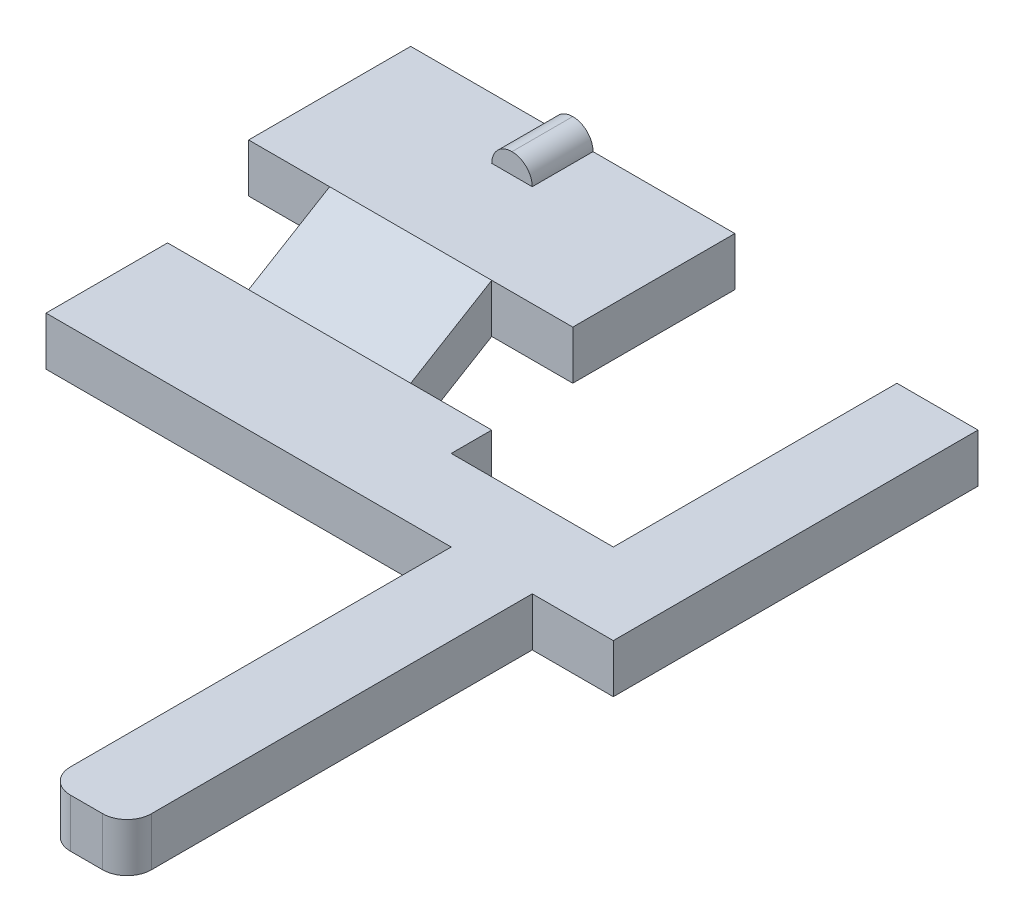
ISO-10303-21;
HEADER;
FILE_DESCRIPTION(('STEP AP214'),'2;1');
FILE_NAME('part.step','',(''),(''),'','','');
FILE_SCHEMA(('AUTOMOTIVE_DESIGN { 1 0 10303 214 1 1 1 1 }'));
ENDSEC;
DATA;
#1=APPLICATION_CONTEXT('core data for automotive mechanical design processes');
#2=APPLICATION_PROTOCOL_DEFINITION('international standard','automotive_design',2000,#1);
#3=PRODUCT_CONTEXT('',#1,'mechanical');
#4=PRODUCT('Part','Part','',(#3));
#5=PRODUCT_RELATED_PRODUCT_CATEGORY('part','',(#4));
#6=PRODUCT_DEFINITION_FORMATION('','',#4);
#7=PRODUCT_DEFINITION_CONTEXT('part definition',#1,'design');
#8=PRODUCT_DEFINITION('design','',#6,#7);
#9=PRODUCT_DEFINITION_SHAPE('','',#8);
#10=(LENGTH_UNIT() NAMED_UNIT(*) SI_UNIT(.MILLI.,.METRE.));
#11=(NAMED_UNIT(*) PLANE_ANGLE_UNIT() SI_UNIT($,.RADIAN.));
#12=(NAMED_UNIT(*) SI_UNIT($,.STERADIAN.) SOLID_ANGLE_UNIT());
#13=UNCERTAINTY_MEASURE_WITH_UNIT(LENGTH_MEASURE(1.E-05),#10,'distance_accuracy_value','');
#14=(GEOMETRIC_REPRESENTATION_CONTEXT(3) GLOBAL_UNCERTAINTY_ASSIGNED_CONTEXT((#13)) GLOBAL_UNIT_ASSIGNED_CONTEXT((#10,
#11,#12)) REPRESENTATION_CONTEXT('',''));
#15=CARTESIAN_POINT('',(0.,0.,0.));
#16=DIRECTION('',(0.,0.,1.));
#17=DIRECTION('',(1.,0.,0.));
#18=AXIS2_PLACEMENT_3D('',#15,#16,#17);
#19=CARTESIAN_POINT('',(-2.,0.6,-6.5));
#20=DIRECTION('',(0.,0.,1.));
#21=DIRECTION('',(1.,0.,0.));
#22=AXIS2_PLACEMENT_3D('',#19,#20,#21);
#23=PLANE('',#22);
#24=DIRECTION('',(-1.,0.,0.));
#25=VECTOR('',#24,1.);
#26=CARTESIAN_POINT('',(-2.,0.,-6.5));
#27=LINE('',#26,#25);
#28=CARTESIAN_POINT('',(-2.,0.,-6.5));
#29=VERTEX_POINT('',#28);
#30=CARTESIAN_POINT('',(-3.,0.,-6.5));
#31=VERTEX_POINT('',#30);
#32=EDGE_CURVE('E325',#29,#31,#27,.T.);
#33=ORIENTED_EDGE('',*,*,#32,.T.);
#34=DIRECTION('',(0.,-1.,0.));
#35=VECTOR('',#34,1.);
#36=CARTESIAN_POINT('',(-3.,0.6,-6.5));
#37=LINE('',#36,#35);
#38=CARTESIAN_POINT('',(-3.,0.6,-6.5));
#39=VERTEX_POINT('',#38);
#40=EDGE_CURVE('E462',#39,#31,#37,.T.);
#41=ORIENTED_EDGE('',*,*,#40,.F.);
#42=DIRECTION('',(-1.,0.,0.));
#43=VECTOR('',#42,1.);
#44=CARTESIAN_POINT('',(-2.,0.6,-6.5));
#45=LINE('',#44,#43);
#46=CARTESIAN_POINT('',(-2.,0.6,-6.5));
#47=VERTEX_POINT('',#46);
#48=EDGE_CURVE('E319',#47,#39,#45,.T.);
#49=ORIENTED_EDGE('',*,*,#48,.F.);
#50=DIRECTION('',(0.,-1.,0.));
#51=VECTOR('',#50,1.);
#52=CARTESIAN_POINT('',(-2.,0.6,-6.5));
#53=LINE('',#52,#51);
#54=EDGE_CURVE('E349',#47,#29,#53,.T.);
#55=ORIENTED_EDGE('',*,*,#54,.T.);
#56=EDGE_LOOP('',(#33,#41,#49,#55));
#57=FACE_BOUND('',#56,.T.);
#58=ADVANCED_FACE('F42',(#57),#23,.F.);
#59=CARTESIAN_POINT('',(-0.999999999999999,0.6,0.));
#60=DIRECTION('',(0.,0.,-1.));
#61=DIRECTION('',(-1.,0.,0.));
#62=AXIS2_PLACEMENT_3D('',#59,#60,#61);
#63=PLANE('',#62);
#64=DIRECTION('',(1.,0.,0.));
#65=VECTOR('',#64,1.);
#66=CARTESIAN_POINT('',(-0.999999999999999,0.6,0.));
#67=LINE('',#66,#65);
#68=CARTESIAN_POINT('',(-0.699999999999999,0.6,0.));
#69=VERTEX_POINT('',#68);
#70=CARTESIAN_POINT('',(-0.3,0.6,0.));
#71=VERTEX_POINT('',#70);
#72=EDGE_CURVE('E292',#69,#71,#67,.T.);
#73=ORIENTED_EDGE('',*,*,#72,.F.);
#74=DIRECTION('',(0.,-1.,0.));
#75=VECTOR('',#74,1.);
#76=CARTESIAN_POINT('',(-0.699999999999999,0.6,0.));
#77=LINE('',#76,#75);
#78=CARTESIAN_POINT('',(-0.699999999999999,0.,0.));
#79=VERTEX_POINT('',#78);
#80=EDGE_CURVE('E373',#69,#79,#77,.T.);
#81=ORIENTED_EDGE('',*,*,#80,.T.);
#82=DIRECTION('',(1.,0.,0.));
#83=VECTOR('',#82,1.);
#84=CARTESIAN_POINT('',(-0.999999999999999,0.,0.));
#85=LINE('',#84,#83);
#86=CARTESIAN_POINT('',(-0.3,0.,0.));
#87=VERTEX_POINT('',#86);
#88=EDGE_CURVE('E449',#79,#87,#85,.T.);
#89=ORIENTED_EDGE('',*,*,#88,.T.);
#90=DIRECTION('',(0.,-1.,0.));
#91=VECTOR('',#90,1.);
#92=CARTESIAN_POINT('',(-0.3,0.6,0.));
#93=LINE('',#92,#91);
#94=EDGE_CURVE('E368',#87,#71,#93,.F.);
#95=ORIENTED_EDGE('',*,*,#94,.T.);
#96=EDGE_LOOP('',(#73,#81,#89,#95));
#97=FACE_BOUND('',#96,.T.);
#98=ADVANCED_FACE('F409',(#97),#63,.F.);
#99=CARTESIAN_POINT('',(0.,0.6,0.));
#100=DIRECTION('',(-1.,0.,0.));
#101=DIRECTION('',(0.,0.,1.));
#102=AXIS2_PLACEMENT_3D('',#99,#100,#101);
#103=PLANE('',#102);
#104=DIRECTION('',(0.,0.,-1.));
#105=VECTOR('',#104,1.);
#106=CARTESIAN_POINT('',(0.,0.6,0.));
#107=LINE('',#106,#105);
#108=CARTESIAN_POINT('',(0.,0.6,-0.3));
#109=VERTEX_POINT('',#108);
#110=CARTESIAN_POINT('',(0.,0.6,-5.));
#111=VERTEX_POINT('',#110);
#112=EDGE_CURVE('E295',#109,#111,#107,.T.);
#113=ORIENTED_EDGE('',*,*,#112,.F.);
#114=DIRECTION('',(0.,-1.,0.));
#115=VECTOR('',#114,1.);
#116=CARTESIAN_POINT('',(0.,0.6,-0.3));
#117=LINE('',#116,#115);
#118=CARTESIAN_POINT('',(0.,0.,-0.3));
#119=VERTEX_POINT('',#118);
#120=EDGE_CURVE('E391',#109,#119,#117,.T.);
#121=ORIENTED_EDGE('',*,*,#120,.T.);
#122=DIRECTION('',(0.,0.,-1.));
#123=VECTOR('',#122,1.);
#124=CARTESIAN_POINT('',(0.,0.,0.));
#125=LINE('',#124,#123);
#126=CARTESIAN_POINT('',(0.,0.,-5.));
#127=VERTEX_POINT('',#126);
#128=EDGE_CURVE('E451',#119,#127,#125,.T.);
#129=ORIENTED_EDGE('',*,*,#128,.T.);
#130=DIRECTION('',(0.,-1.,0.));
#131=VECTOR('',#130,1.);
#132=CARTESIAN_POINT('',(0.,0.6,-5.));
#133=LINE('',#132,#131);
#134=EDGE_CURVE('E366',#111,#127,#133,.T.);
#135=ORIENTED_EDGE('',*,*,#134,.F.);
#136=EDGE_LOOP('',(#113,#121,#129,#135));
#137=FACE_BOUND('',#136,.T.);
#138=ADVANCED_FACE('F416',(#137),#103,.F.);
#139=CARTESIAN_POINT('',(0.,0.6,-5.));
#140=DIRECTION('',(0.,0.,-1.));
#141=DIRECTION('',(-1.,0.,0.));
#142=AXIS2_PLACEMENT_3D('',#139,#140,#141);
#143=PLANE('',#142);
#144=DIRECTION('',(1.,0.,0.));
#145=VECTOR('',#144,1.);
#146=CARTESIAN_POINT('',(0.,0.,-5.));
#147=LINE('',#146,#145);
#148=CARTESIAN_POINT('',(1.,0.,-5.));
#149=VERTEX_POINT('',#148);
#150=EDGE_CURVE('E570',#127,#149,#147,.T.);
#151=ORIENTED_EDGE('',*,*,#150,.T.);
#152=DIRECTION('',(0.,-1.,0.));
#153=VECTOR('',#152,1.);
#154=CARTESIAN_POINT('',(1.,0.6,-5.));
#155=LINE('',#154,#153);
#156=CARTESIAN_POINT('',(1.,0.6,-5.));
#157=VERTEX_POINT('',#156);
#158=EDGE_CURVE('E364',#157,#149,#155,.T.);
#159=ORIENTED_EDGE('',*,*,#158,.F.);
#160=DIRECTION('',(1.,0.,0.));
#161=VECTOR('',#160,1.);
#162=CARTESIAN_POINT('',(0.,0.6,-5.));
#163=LINE('',#162,#161);
#164=EDGE_CURVE('E298',#111,#157,#163,.T.);
#165=ORIENTED_EDGE('',*,*,#164,.F.);
#166=ORIENTED_EDGE('',*,*,#134,.T.);
#167=EDGE_LOOP('',(#151,#159,#165,#166));
#168=FACE_BOUND('',#167,.T.);
#169=ADVANCED_FACE('F668',(#168),#143,.F.);
#170=CARTESIAN_POINT('',(1.,0.6,-5.));
#171=DIRECTION('',(-1.,0.,0.));
#172=DIRECTION('',(0.,0.,1.));
#173=AXIS2_PLACEMENT_3D('',#170,#171,#172);
#174=PLANE('',#173);
#175=DIRECTION('',(0.,0.,-1.));
#176=VECTOR('',#175,1.);
#177=CARTESIAN_POINT('',(1.,0.,-5.));
#178=LINE('',#177,#176);
#179=CARTESIAN_POINT('',(1.,0.,-9.5));
#180=VERTEX_POINT('',#179);
#181=EDGE_CURVE('E572',#149,#180,#178,.T.);
#182=ORIENTED_EDGE('',*,*,#181,.T.);
#183=DIRECTION('',(0.,-1.,0.));
#184=VECTOR('',#183,1.);
#185=CARTESIAN_POINT('',(1.,0.6,-9.5));
#186=LINE('',#185,#184);
#187=CARTESIAN_POINT('',(1.,0.6,-9.5));
#188=VERTEX_POINT('',#187);
#189=EDGE_CURVE('E361',#188,#180,#186,.T.);
#190=ORIENTED_EDGE('',*,*,#189,.F.);
#191=DIRECTION('',(0.,0.,-1.));
#192=VECTOR('',#191,1.);
#193=CARTESIAN_POINT('',(1.,0.6,-5.));
#194=LINE('',#193,#192);
#195=EDGE_CURVE('E300',#157,#188,#194,.T.);
#196=ORIENTED_EDGE('',*,*,#195,.F.);
#197=ORIENTED_EDGE('',*,*,#158,.T.);
#198=EDGE_LOOP('',(#182,#190,#196,#197));
#199=FACE_BOUND('',#198,.T.);
#200=ADVANCED_FACE('F741',(#199),#174,.F.);
#201=CARTESIAN_POINT('',(1.,0.6,-9.5));
#202=DIRECTION('',(0.,0.,1.));
#203=DIRECTION('',(1.,0.,0.));
#204=AXIS2_PLACEMENT_3D('',#201,#202,#203);
#205=PLANE('',#204);
#206=DIRECTION('',(-1.,0.,0.));
#207=VECTOR('',#206,1.);
#208=CARTESIAN_POINT('',(1.,0.,-9.5));
#209=LINE('',#208,#207);
#210=CARTESIAN_POINT('',(0.,0.,-9.5));
#211=VERTEX_POINT('',#210);
#212=EDGE_CURVE('E577',#180,#211,#209,.T.);
#213=ORIENTED_EDGE('',*,*,#212,.T.);
#214=DIRECTION('',(0.,-1.,0.));
#215=VECTOR('',#214,1.);
#216=CARTESIAN_POINT('',(0.,0.6,-9.5));
#217=LINE('',#216,#215);
#218=CARTESIAN_POINT('',(0.,0.6,-9.5));
#219=VERTEX_POINT('',#218);
#220=EDGE_CURVE('E358',#219,#211,#217,.T.);
#221=ORIENTED_EDGE('',*,*,#220,.F.);
#222=DIRECTION('',(-1.,0.,0.));
#223=VECTOR('',#222,1.);
#224=CARTESIAN_POINT('',(1.,0.6,-9.5));
#225=LINE('',#224,#223);
#226=EDGE_CURVE('E302',#188,#219,#225,.T.);
#227=ORIENTED_EDGE('',*,*,#226,.F.);
#228=ORIENTED_EDGE('',*,*,#189,.T.);
#229=EDGE_LOOP('',(#213,#221,#227,#228));
#230=FACE_BOUND('',#229,.T.);
#231=ADVANCED_FACE('F744',(#230),#205,.F.);
#232=CARTESIAN_POINT('',(0.,0.6,-9.5));
#233=DIRECTION('',(1.,0.,0.));
#234=DIRECTION('',(0.,0.,-1.));
#235=AXIS2_PLACEMENT_3D('',#232,#233,#234);
#236=PLANE('',#235);
#237=DIRECTION('',(0.,0.,1.));
#238=VECTOR('',#237,1.);
#239=CARTESIAN_POINT('',(0.,0.,-9.5));
#240=LINE('',#239,#238);
#241=CARTESIAN_POINT('',(0.,0.,-6.));
#242=VERTEX_POINT('',#241);
#243=EDGE_CURVE('E579',#211,#242,#240,.T.);
#244=ORIENTED_EDGE('',*,*,#243,.T.);
#245=DIRECTION('',(0.,-1.,0.));
#246=VECTOR('',#245,1.);
#247=CARTESIAN_POINT('',(0.,0.6,-6.));
#248=LINE('',#247,#246);
#249=CARTESIAN_POINT('',(0.,0.6,-6.));
#250=VERTEX_POINT('',#249);
#251=EDGE_CURVE('E355',#250,#242,#248,.T.);
#252=ORIENTED_EDGE('',*,*,#251,.F.);
#253=DIRECTION('',(0.,0.,1.));
#254=VECTOR('',#253,1.);
#255=CARTESIAN_POINT('',(0.,0.6,-9.5));
#256=LINE('',#255,#254);
#257=EDGE_CURVE('E304',#219,#250,#256,.T.);
#258=ORIENTED_EDGE('',*,*,#257,.F.);
#259=ORIENTED_EDGE('',*,*,#220,.T.);
#260=EDGE_LOOP('',(#244,#252,#258,#259));
#261=FACE_BOUND('',#260,.T.);
#262=ADVANCED_FACE('F748',(#261),#236,.F.);
#263=CARTESIAN_POINT('',(0.,0.6,-6.));
#264=DIRECTION('',(0.,0.,1.));
#265=DIRECTION('',(1.,0.,0.));
#266=AXIS2_PLACEMENT_3D('',#263,#264,#265);
#267=PLANE('',#266);
#268=DIRECTION('',(-1.,0.,0.));
#269=VECTOR('',#268,1.);
#270=CARTESIAN_POINT('',(0.,0.,-6.));
#271=LINE('',#270,#269);
#272=CARTESIAN_POINT('',(-2.,0.,-6.));
#273=VERTEX_POINT('',#272);
#274=EDGE_CURVE('E580',#242,#273,#271,.T.);
#275=ORIENTED_EDGE('',*,*,#274,.T.);
#276=DIRECTION('',(0.,-1.,0.));
#277=VECTOR('',#276,1.);
#278=CARTESIAN_POINT('',(-2.,0.6,-6.));
#279=LINE('',#278,#277);
#280=CARTESIAN_POINT('',(-2.,0.6,-6.));
#281=VERTEX_POINT('',#280);
#282=EDGE_CURVE('E352',#281,#273,#279,.T.);
#283=ORIENTED_EDGE('',*,*,#282,.F.);
#284=DIRECTION('',(-1.,0.,0.));
#285=VECTOR('',#284,1.);
#286=CARTESIAN_POINT('',(0.,0.6,-6.));
#287=LINE('',#286,#285);
#288=EDGE_CURVE('E306',#250,#281,#287,.T.);
#289=ORIENTED_EDGE('',*,*,#288,.F.);
#290=ORIENTED_EDGE('',*,*,#251,.T.);
#291=EDGE_LOOP('',(#275,#283,#289,#290));
#292=FACE_BOUND('',#291,.T.);
#293=ADVANCED_FACE('F431',(#292),#267,.F.);
#294=CARTESIAN_POINT('',(-2.,0.6,-6.));
#295=DIRECTION('',(-1.,0.,0.));
#296=DIRECTION('',(0.,0.,1.));
#297=AXIS2_PLACEMENT_3D('',#294,#295,#296);
#298=PLANE('',#297);
#299=DIRECTION('',(0.,0.,-1.));
#300=VECTOR('',#299,1.);
#301=CARTESIAN_POINT('',(-2.,0.,-6.));
#302=LINE('',#301,#300);
#303=EDGE_CURVE('E326',#273,#29,#302,.T.);
#304=ORIENTED_EDGE('',*,*,#303,.T.);
#305=ORIENTED_EDGE('',*,*,#54,.F.);
#306=DIRECTION('',(0.,0.,-1.));
#307=VECTOR('',#306,1.);
#308=CARTESIAN_POINT('',(-2.,0.6,-6.));
#309=LINE('',#308,#307);
#310=EDGE_CURVE('E308',#281,#47,#309,.T.);
#311=ORIENTED_EDGE('',*,*,#310,.F.);
#312=ORIENTED_EDGE('',*,*,#282,.T.);
#313=EDGE_LOOP('',(#304,#305,#311,#312));
#314=FACE_BOUND('',#313,.T.);
#315=ADVANCED_FACE('F423',(#314),#298,.F.);
#316=CARTESIAN_POINT('',(-5.,0.6,-6.5));
#317=VERTEX_POINT('',#316);
#318=CARTESIAN_POINT('',(-6.,0.6,-6.5));
#319=VERTEX_POINT('',#318);
#320=EDGE_CURVE('E310',#317,#319,#45,.T.);
#321=ORIENTED_EDGE('',*,*,#320,.F.);
#322=DIRECTION('',(0.,1.,0.));
#323=VECTOR('',#322,1.);
#324=CARTESIAN_POINT('',(-5.,0.6,-6.5));
#325=LINE('',#324,#323);
#326=CARTESIAN_POINT('',(-5.,0.,-6.5));
#327=VERTEX_POINT('',#326);
#328=EDGE_CURVE('E437',#327,#317,#325,.T.);
#329=ORIENTED_EDGE('',*,*,#328,.F.);
#330=CARTESIAN_POINT('',(-6.,0.,-6.5));
#331=VERTEX_POINT('',#330);
#332=EDGE_CURVE('E322',#327,#331,#27,.T.);
#333=ORIENTED_EDGE('',*,*,#332,.T.);
#334=DIRECTION('',(0.,-1.,0.));
#335=VECTOR('',#334,1.);
#336=CARTESIAN_POINT('',(-6.,0.6,-6.5));
#337=LINE('',#336,#335);
#338=EDGE_CURVE('E346',#319,#331,#337,.T.);
#339=ORIENTED_EDGE('',*,*,#338,.F.);
#340=EDGE_LOOP('',(#321,#329,#333,#339));
#341=FACE_BOUND('',#340,.T.);
#342=ADVANCED_FACE('F412',(#341),#23,.F.);
#343=CARTESIAN_POINT('',(-6.,0.6,-6.5));
#344=DIRECTION('',(1.,0.,0.));
#345=DIRECTION('',(0.,0.,-1.));
#346=AXIS2_PLACEMENT_3D('',#343,#344,#345);
#347=PLANE('',#346);
#348=DIRECTION('',(0.,0.,1.));
#349=VECTOR('',#348,1.);
#350=CARTESIAN_POINT('',(-6.,0.,-6.5));
#351=LINE('',#350,#349);
#352=CARTESIAN_POINT('',(-6.,0.,-5.));
#353=VERTEX_POINT('',#352);
#354=EDGE_CURVE('E332',#331,#353,#351,.T.);
#355=ORIENTED_EDGE('',*,*,#354,.T.);
#356=DIRECTION('',(0.,-1.,0.));
#357=VECTOR('',#356,1.);
#358=CARTESIAN_POINT('',(-6.,0.6,-5.));
#359=LINE('',#358,#357);
#360=CARTESIAN_POINT('',(-6.,0.6,-5.));
#361=VERTEX_POINT('',#360);
#362=EDGE_CURVE('E342',#361,#353,#359,.T.);
#363=ORIENTED_EDGE('',*,*,#362,.F.);
#364=DIRECTION('',(0.,0.,1.));
#365=VECTOR('',#364,1.);
#366=CARTESIAN_POINT('',(-6.,0.6,-6.5));
#367=LINE('',#366,#365);
#368=EDGE_CURVE('E313',#319,#361,#367,.T.);
#369=ORIENTED_EDGE('',*,*,#368,.F.);
#370=ORIENTED_EDGE('',*,*,#338,.T.);
#371=EDGE_LOOP('',(#355,#363,#369,#370));
#372=FACE_BOUND('',#371,.T.);
#373=ADVANCED_FACE('F422',(#372),#347,.F.);
#374=CARTESIAN_POINT('',(-6.,0.6,-5.));
#375=DIRECTION('',(0.,0.,-1.));
#376=DIRECTION('',(-1.,0.,0.));
#377=AXIS2_PLACEMENT_3D('',#374,#375,#376);
#378=PLANE('',#377);
#379=DIRECTION('',(1.,0.,0.));
#380=VECTOR('',#379,1.);
#381=CARTESIAN_POINT('',(-6.,0.,-5.));
#382=LINE('',#381,#380);
#383=CARTESIAN_POINT('',(-1.,0.,-5.));
#384=VERTEX_POINT('',#383);
#385=EDGE_CURVE('E335',#353,#384,#382,.T.);
#386=ORIENTED_EDGE('',*,*,#385,.T.);
#387=DIRECTION('',(0.,-1.,0.));
#388=VECTOR('',#387,1.);
#389=CARTESIAN_POINT('',(-1.,0.6,-5.));
#390=LINE('',#389,#388);
#391=CARTESIAN_POINT('',(-1.,0.6,-5.));
#392=VERTEX_POINT('',#391);
#393=EDGE_CURVE('E339',#392,#384,#390,.T.);
#394=ORIENTED_EDGE('',*,*,#393,.F.);
#395=DIRECTION('',(1.,0.,0.));
#396=VECTOR('',#395,1.);
#397=CARTESIAN_POINT('',(-6.,0.6,-5.));
#398=LINE('',#397,#396);
#399=EDGE_CURVE('E839',#361,#392,#398,.T.);
#400=ORIENTED_EDGE('',*,*,#399,.F.);
#401=ORIENTED_EDGE('',*,*,#362,.T.);
#402=EDGE_LOOP('',(#386,#394,#400,#401));
#403=FACE_BOUND('',#402,.T.);
#404=ADVANCED_FACE('F429',(#403),#378,.F.);
#405=CARTESIAN_POINT('',(-1.,0.6,-5.));
#406=DIRECTION('',(1.,0.,0.));
#407=DIRECTION('',(0.,0.,-1.));
#408=AXIS2_PLACEMENT_3D('',#405,#406,#407);
#409=PLANE('',#408);
#410=DIRECTION('',(0.,0.,1.));
#411=VECTOR('',#410,1.);
#412=CARTESIAN_POINT('',(-1.,0.,-5.));
#413=LINE('',#412,#411);
#414=CARTESIAN_POINT('',(-0.999999999999999,0.,-0.3));
#415=VERTEX_POINT('',#414);
#416=EDGE_CURVE('E296',#384,#415,#413,.T.);
#417=ORIENTED_EDGE('',*,*,#416,.T.);
#418=DIRECTION('',(0.,-1.,0.));
#419=VECTOR('',#418,1.);
#420=CARTESIAN_POINT('',(-0.999999999999999,0.6,-0.3));
#421=LINE('',#420,#419);
#422=CARTESIAN_POINT('',(-0.999999999999999,0.6,-0.3));
#423=VERTEX_POINT('',#422);
#424=EDGE_CURVE('E385',#415,#423,#421,.F.);
#425=ORIENTED_EDGE('',*,*,#424,.T.);
#426=DIRECTION('',(0.,0.,1.));
#427=VECTOR('',#426,1.);
#428=CARTESIAN_POINT('',(-1.,0.6,-5.));
#429=LINE('',#428,#427);
#430=EDGE_CURVE('E343',#392,#423,#429,.T.);
#431=ORIENTED_EDGE('',*,*,#430,.F.);
#432=ORIENTED_EDGE('',*,*,#393,.T.);
#433=EDGE_LOOP('',(#417,#425,#431,#432));
#434=FACE_BOUND('',#433,.T.);
#435=ADVANCED_FACE('F538',(#434),#409,.F.);
#436=CARTESIAN_POINT('',(0.,0.6,0.));
#437=DIRECTION('',(0.,1.,0.));
#438=DIRECTION('',(0.,0.,1.));
#439=AXIS2_PLACEMENT_3D('',#436,#437,#438);
#440=PLANE('',#439);
#441=ORIENTED_EDGE('',*,*,#430,.T.);
#442=CARTESIAN_POINT('',(-0.699999999999999,0.6,-0.3));
#443=DIRECTION('',(0.,1.,0.));
#444=DIRECTION('',(0.,0.,1.));
#445=AXIS2_PLACEMENT_3D('',#442,#443,#444);
#446=CIRCLE('',#445,0.3);
#447=EDGE_CURVE('E389',#423,#69,#446,.T.);
#448=ORIENTED_EDGE('',*,*,#447,.T.);
#449=ORIENTED_EDGE('',*,*,#72,.T.);
#450=CARTESIAN_POINT('',(-0.3,0.6,-0.3));
#451=DIRECTION('',(0.,1.,0.));
#452=DIRECTION('',(0.,0.,1.));
#453=AXIS2_PLACEMENT_3D('',#450,#451,#452);
#454=CIRCLE('',#453,0.3);
#455=EDGE_CURVE('E387',#71,#109,#454,.T.);
#456=ORIENTED_EDGE('',*,*,#455,.T.);
#457=ORIENTED_EDGE('',*,*,#112,.T.);
#458=ORIENTED_EDGE('',*,*,#164,.T.);
#459=ORIENTED_EDGE('',*,*,#195,.T.);
#460=ORIENTED_EDGE('',*,*,#226,.T.);
#461=ORIENTED_EDGE('',*,*,#257,.T.);
#462=ORIENTED_EDGE('',*,*,#288,.T.);
#463=ORIENTED_EDGE('',*,*,#310,.T.);
#464=ORIENTED_EDGE('',*,*,#48,.T.);
#465=DIRECTION('',(1.,0.,0.));
#466=VECTOR('',#465,1.);
#467=CARTESIAN_POINT('',(-3.,0.6,-6.5));
#468=LINE('',#467,#466);
#469=EDGE_CURVE('E442',#317,#39,#468,.T.);
#470=ORIENTED_EDGE('',*,*,#469,.F.);
#471=ORIENTED_EDGE('',*,*,#320,.T.);
#472=ORIENTED_EDGE('',*,*,#368,.T.);
#473=ORIENTED_EDGE('',*,*,#399,.T.);
#474=EDGE_LOOP('',(#441,#448,#449,#456,#457,#458,#459,#460,#461,#462,#463,#464,#470,#471,#472,#473));
#475=FACE_BOUND('',#474,.T.);
#476=ADVANCED_FACE('F444',(#475),#440,.T.);
#477=CARTESIAN_POINT('',(0.,0.,0.));
#478=DIRECTION('',(0.,1.,0.));
#479=DIRECTION('',(0.,0.,1.));
#480=AXIS2_PLACEMENT_3D('',#477,#478,#479);
#481=PLANE('',#480);
#482=ORIENTED_EDGE('',*,*,#88,.F.);
#483=CARTESIAN_POINT('',(-0.699999999999999,0.,-0.3));
#484=DIRECTION('',(0.,1.,0.));
#485=DIRECTION('',(0.,0.,1.));
#486=AXIS2_PLACEMENT_3D('',#483,#484,#485);
#487=CIRCLE('',#486,0.3);
#488=EDGE_CURVE('E383',#79,#415,#487,.F.);
#489=ORIENTED_EDGE('',*,*,#488,.T.);
#490=ORIENTED_EDGE('',*,*,#416,.F.);
#491=ORIENTED_EDGE('',*,*,#385,.F.);
#492=ORIENTED_EDGE('',*,*,#354,.F.);
#493=ORIENTED_EDGE('',*,*,#332,.F.);
#494=DIRECTION('',(-1.,0.,0.));
#495=VECTOR('',#494,1.);
#496=CARTESIAN_POINT('',(-3.,0.,-6.5));
#497=LINE('',#496,#495);
#498=EDGE_CURVE('E453',#31,#327,#497,.T.);
#499=ORIENTED_EDGE('',*,*,#498,.F.);
#500=ORIENTED_EDGE('',*,*,#32,.F.);
#501=ORIENTED_EDGE('',*,*,#303,.F.);
#502=ORIENTED_EDGE('',*,*,#274,.F.);
#503=ORIENTED_EDGE('',*,*,#243,.F.);
#504=ORIENTED_EDGE('',*,*,#212,.F.);
#505=ORIENTED_EDGE('',*,*,#181,.F.);
#506=ORIENTED_EDGE('',*,*,#150,.F.);
#507=ORIENTED_EDGE('',*,*,#128,.F.);
#508=CARTESIAN_POINT('',(-0.3,0.,-0.3));
#509=DIRECTION('',(0.,1.,0.));
#510=DIRECTION('',(0.,0.,1.));
#511=AXIS2_PLACEMENT_3D('',#508,#509,#510);
#512=CIRCLE('',#511,0.3);
#513=EDGE_CURVE('E379',#119,#87,#512,.F.);
#514=ORIENTED_EDGE('',*,*,#513,.T.);
#515=EDGE_LOOP('',(#482,#489,#490,#491,#492,#493,#499,#500,#501,#502,#503,#504,#505,#506,#507,#514));
#516=FACE_BOUND('',#515,.T.);
#517=ADVANCED_FACE('F537',(#516),#481,.F.);
#518=CARTESIAN_POINT('',(-5.,0.,0.));
#519=DIRECTION('',(-1.,0.,0.));
#520=DIRECTION('',(0.,0.,1.));
#521=AXIS2_PLACEMENT_3D('',#518,#519,#520);
#522=PLANE('',#521);
#523=DIRECTION('',(0.,-0.514495755427526,0.857492925712544));
#524=VECTOR('',#523,1.);
#525=CARTESIAN_POINT('',(-5.,0.6,-7.5));
#526=LINE('',#525,#524);
#527=CARTESIAN_POINT('',(-5.,0.6,-7.5));
#528=VERTEX_POINT('',#527);
#529=EDGE_CURVE('E501',#528,#327,#526,.T.);
#530=ORIENTED_EDGE('',*,*,#529,.T.);
#531=ORIENTED_EDGE('',*,*,#328,.T.);
#532=DIRECTION('',(0.,-0.514495755427526,0.857492925712544));
#533=VECTOR('',#532,1.);
#534=CARTESIAN_POINT('',(-5.,1.2,-7.5));
#535=LINE('',#534,#533);
#536=CARTESIAN_POINT('',(-5.,1.2,-7.5));
#537=VERTEX_POINT('',#536);
#538=EDGE_CURVE('E502',#537,#317,#535,.T.);
#539=ORIENTED_EDGE('',*,*,#538,.F.);
#540=DIRECTION('',(0.,-1.,0.));
#541=VECTOR('',#540,1.);
#542=CARTESIAN_POINT('',(-5.,1.2,-7.5));
#543=LINE('',#542,#541);
#544=EDGE_CURVE('E276',#537,#528,#543,.T.);
#545=ORIENTED_EDGE('',*,*,#544,.T.);
#546=EDGE_LOOP('',(#530,#531,#539,#545));
#547=FACE_BOUND('',#546,.T.);
#548=ADVANCED_FACE('F541',(#547),#522,.T.);
#549=CARTESIAN_POINT('',(0.,-2.42647058823529,-1.45588235294118));
#550=DIRECTION('',(0.,0.857492925712544,0.514495755427526));
#551=DIRECTION('',(0.,-0.514495755427526,0.857492925712544));
#552=AXIS2_PLACEMENT_3D('',#549,#550,#551);
#553=PLANE('',#552);
#554=ORIENTED_EDGE('',*,*,#538,.T.);
#555=ORIENTED_EDGE('',*,*,#469,.T.);
#556=DIRECTION('',(0.,-0.514495755427526,0.857492925712544));
#557=VECTOR('',#556,1.);
#558=CARTESIAN_POINT('',(-3.,1.2,-7.5));
#559=LINE('',#558,#557);
#560=CARTESIAN_POINT('',(-3.,1.2,-7.5));
#561=VERTEX_POINT('',#560);
#562=EDGE_CURVE('E589',#561,#39,#559,.T.);
#563=ORIENTED_EDGE('',*,*,#562,.F.);
#564=DIRECTION('',(-1.,0.,0.));
#565=VECTOR('',#564,1.);
#566=CARTESIAN_POINT('',(-3.,1.2,-7.5));
#567=LINE('',#566,#565);
#568=EDGE_CURVE('E285',#561,#537,#567,.T.);
#569=ORIENTED_EDGE('',*,*,#568,.T.);
#570=EDGE_LOOP('',(#554,#555,#563,#569));
#571=FACE_BOUND('',#570,.T.);
#572=ADVANCED_FACE('F529',(#571),#553,.T.);
#573=CARTESIAN_POINT('',(0.,-2.86764705882353,-1.72058823529412));
#574=DIRECTION('',(0.,-0.857492925712544,-0.514495755427526));
#575=DIRECTION('',(0.,0.514495755427526,-0.857492925712544));
#576=AXIS2_PLACEMENT_3D('',#573,#574,#575);
#577=PLANE('',#576);
#578=DIRECTION('',(0.,-0.514495755427526,0.857492925712544));
#579=VECTOR('',#578,1.);
#580=CARTESIAN_POINT('',(-3.,0.6,-7.5));
#581=LINE('',#580,#579);
#582=CARTESIAN_POINT('',(-3.,0.6,-7.5));
#583=VERTEX_POINT('',#582);
#584=EDGE_CURVE('E504',#583,#31,#581,.T.);
#585=ORIENTED_EDGE('',*,*,#584,.T.);
#586=ORIENTED_EDGE('',*,*,#498,.T.);
#587=ORIENTED_EDGE('',*,*,#529,.F.);
#588=DIRECTION('',(1.,0.,0.));
#589=VECTOR('',#588,1.);
#590=CARTESIAN_POINT('',(-3.,0.6,-7.5));
#591=LINE('',#590,#589);
#592=EDGE_CURVE('E270',#528,#583,#591,.T.);
#593=ORIENTED_EDGE('',*,*,#592,.T.);
#594=EDGE_LOOP('',(#585,#586,#587,#593));
#595=FACE_BOUND('',#594,.T.);
#596=ADVANCED_FACE('F518',(#595),#577,.T.);
#597=CARTESIAN_POINT('',(-3.,0.,0.));
#598=DIRECTION('',(1.,0.,0.));
#599=DIRECTION('',(0.,0.,-1.));
#600=AXIS2_PLACEMENT_3D('',#597,#598,#599);
#601=PLANE('',#600);
#602=ORIENTED_EDGE('',*,*,#562,.T.);
#603=ORIENTED_EDGE('',*,*,#40,.T.);
#604=ORIENTED_EDGE('',*,*,#584,.F.);
#605=DIRECTION('',(0.,1.,0.));
#606=VECTOR('',#605,1.);
#607=CARTESIAN_POINT('',(-3.,1.2,-7.5));
#608=LINE('',#607,#606);
#609=EDGE_CURVE('E265',#583,#561,#608,.T.);
#610=ORIENTED_EDGE('',*,*,#609,.T.);
#611=EDGE_LOOP('',(#602,#603,#604,#610));
#612=FACE_BOUND('',#611,.T.);
#613=ADVANCED_FACE('F528',(#612),#601,.T.);
#614=CARTESIAN_POINT('',(-6.,1.2,-7.5));
#615=DIRECTION('',(0.,0.,-1.));
#616=DIRECTION('',(-1.,0.,0.));
#617=AXIS2_PLACEMENT_3D('',#614,#615,#616);
#618=PLANE('',#617);
#619=DIRECTION('',(1.,0.,0.));
#620=VECTOR('',#619,1.);
#621=CARTESIAN_POINT('',(-6.,1.2,-7.5));
#622=LINE('',#621,#620);
#623=CARTESIAN_POINT('',(-2.,1.2,-7.5));
#624=VERTEX_POINT('',#623);
#625=EDGE_CURVE('E229',#561,#624,#622,.T.);
#626=ORIENTED_EDGE('',*,*,#625,.F.);
#627=ORIENTED_EDGE('',*,*,#609,.F.);
#628=DIRECTION('',(1.,0.,0.));
#629=VECTOR('',#628,1.);
#630=CARTESIAN_POINT('',(-6.,0.6,-7.5));
#631=LINE('',#630,#629);
#632=CARTESIAN_POINT('',(-2.,0.6,-7.5));
#633=VERTEX_POINT('',#632);
#634=EDGE_CURVE('E242',#583,#633,#631,.T.);
#635=ORIENTED_EDGE('',*,*,#634,.T.);
#636=DIRECTION('',(0.,-1.,0.));
#637=VECTOR('',#636,1.);
#638=CARTESIAN_POINT('',(-2.,1.2,-7.5));
#639=LINE('',#638,#637);
#640=EDGE_CURVE('E261',#624,#633,#639,.T.);
#641=ORIENTED_EDGE('',*,*,#640,.F.);
#642=EDGE_LOOP('',(#626,#627,#635,#641));
#643=FACE_BOUND('',#642,.T.);
#644=ADVANCED_FACE('F534',(#643),#618,.F.);
#645=CARTESIAN_POINT('',(-6.,0.6,-7.5));
#646=VERTEX_POINT('',#645);
#647=EDGE_CURVE('E245',#646,#528,#631,.T.);
#648=ORIENTED_EDGE('',*,*,#647,.T.);
#649=ORIENTED_EDGE('',*,*,#544,.F.);
#650=CARTESIAN_POINT('',(-6.,1.2,-7.5));
#651=VERTEX_POINT('',#650);
#652=EDGE_CURVE('E239',#651,#537,#622,.T.);
#653=ORIENTED_EDGE('',*,*,#652,.F.);
#654=DIRECTION('',(0.,-1.,0.));
#655=VECTOR('',#654,1.);
#656=CARTESIAN_POINT('',(-6.,1.2,-7.5));
#657=LINE('',#656,#655);
#658=EDGE_CURVE('E263',#651,#646,#657,.T.);
#659=ORIENTED_EDGE('',*,*,#658,.T.);
#660=EDGE_LOOP('',(#648,#649,#653,#659));
#661=FACE_BOUND('',#660,.T.);
#662=ADVANCED_FACE('F614',(#661),#618,.F.);
#663=CARTESIAN_POINT('',(-6.,1.2,-9.5));
#664=DIRECTION('',(1.,0.,0.));
#665=DIRECTION('',(0.,0.,-1.));
#666=AXIS2_PLACEMENT_3D('',#663,#664,#665);
#667=PLANE('',#666);
#668=DIRECTION('',(0.,0.,1.));
#669=VECTOR('',#668,1.);
#670=CARTESIAN_POINT('',(-6.,0.6,-9.5));
#671=LINE('',#670,#669);
#672=CARTESIAN_POINT('',(-6.,0.6,-9.5));
#673=VERTEX_POINT('',#672);
#674=EDGE_CURVE('E221',#673,#646,#671,.T.);
#675=ORIENTED_EDGE('',*,*,#674,.T.);
#676=ORIENTED_EDGE('',*,*,#658,.F.);
#677=DIRECTION('',(0.,0.,1.));
#678=VECTOR('',#677,1.);
#679=CARTESIAN_POINT('',(-6.,1.2,-9.5));
#680=LINE('',#679,#678);
#681=CARTESIAN_POINT('',(-6.,1.2,-9.5));
#682=VERTEX_POINT('',#681);
#683=EDGE_CURVE('E226',#682,#651,#680,.T.);
#684=ORIENTED_EDGE('',*,*,#683,.F.);
#685=DIRECTION('',(0.,-1.,0.));
#686=VECTOR('',#685,1.);
#687=CARTESIAN_POINT('',(-6.,1.2,-9.5));
#688=LINE('',#687,#686);
#689=EDGE_CURVE('E254',#682,#673,#688,.T.);
#690=ORIENTED_EDGE('',*,*,#689,.T.);
#691=EDGE_LOOP('',(#675,#676,#684,#690));
#692=FACE_BOUND('',#691,.T.);
#693=ADVANCED_FACE('F610',(#692),#667,.F.);
#694=CARTESIAN_POINT('',(-2.,1.2,-9.5));
#695=DIRECTION('',(-1.,0.,0.));
#696=DIRECTION('',(0.,0.,1.));
#697=AXIS2_PLACEMENT_3D('',#694,#695,#696);
#698=PLANE('',#697);
#699=DIRECTION('',(0.,0.,-1.));
#700=VECTOR('',#699,1.);
#701=CARTESIAN_POINT('',(-2.,0.6,-9.5));
#702=LINE('',#701,#700);
#703=CARTESIAN_POINT('',(-2.,0.6,-9.5));
#704=VERTEX_POINT('',#703);
#705=EDGE_CURVE('E250',#633,#704,#702,.T.);
#706=ORIENTED_EDGE('',*,*,#705,.T.);
#707=DIRECTION('',(0.,-1.,0.));
#708=VECTOR('',#707,1.);
#709=CARTESIAN_POINT('',(-2.,1.2,-9.5));
#710=LINE('',#709,#708);
#711=CARTESIAN_POINT('',(-2.,1.2,-9.5));
#712=VERTEX_POINT('',#711);
#713=EDGE_CURVE('E257',#712,#704,#710,.T.);
#714=ORIENTED_EDGE('',*,*,#713,.F.);
#715=DIRECTION('',(0.,0.,-1.));
#716=VECTOR('',#715,1.);
#717=CARTESIAN_POINT('',(-2.,1.2,-9.5));
#718=LINE('',#717,#716);
#719=EDGE_CURVE('E233',#624,#712,#718,.T.);
#720=ORIENTED_EDGE('',*,*,#719,.F.);
#721=ORIENTED_EDGE('',*,*,#640,.T.);
#722=EDGE_LOOP('',(#706,#714,#720,#721));
#723=FACE_BOUND('',#722,.T.);
#724=ADVANCED_FACE('F613',(#723),#698,.F.);
#725=CARTESIAN_POINT('',(-6.,1.2,-9.5));
#726=DIRECTION('',(0.,0.,1.));
#727=DIRECTION('',(1.,0.,0.));
#728=AXIS2_PLACEMENT_3D('',#725,#726,#727);
#729=PLANE('',#728);
#730=CARTESIAN_POINT('',(-4.,1.2,-9.5));
#731=DIRECTION('',(0.,0.,1.));
#732=DIRECTION('',(1.,0.,0.));
#733=AXIS2_PLACEMENT_3D('',#730,#731,#732);
#734=CIRCLE('',#733,0.25);
#735=CARTESIAN_POINT('',(-4.25,1.2,-9.5));
#736=VERTEX_POINT('',#735);
#737=CARTESIAN_POINT('',(-4.,1.45,-9.5));
#738=VERTEX_POINT('',#737);
#739=EDGE_CURVE('E64',#736,#738,#734,.F.);
#740=ORIENTED_EDGE('',*,*,#739,.T.);
#741=CARTESIAN_POINT('',(-4.,1.2,-9.5));
#742=DIRECTION('',(0.,0.,1.));
#743=DIRECTION('',(1.,0.,0.));
#744=AXIS2_PLACEMENT_3D('',#741,#742,#743);
#745=CIRCLE('',#744,0.25);
#746=CARTESIAN_POINT('',(-3.75,1.2,-9.5));
#747=VERTEX_POINT('',#746);
#748=EDGE_CURVE('E212',#738,#747,#745,.F.);
#749=ORIENTED_EDGE('',*,*,#748,.T.);
#750=DIRECTION('',(-1.,0.,0.));
#751=VECTOR('',#750,1.);
#752=CARTESIAN_POINT('',(-6.,1.2,-9.5));
#753=LINE('',#752,#751);
#754=EDGE_CURVE('E258',#712,#747,#753,.T.);
#755=ORIENTED_EDGE('',*,*,#754,.F.);
#756=ORIENTED_EDGE('',*,*,#713,.T.);
#757=DIRECTION('',(-1.,0.,0.));
#758=VECTOR('',#757,1.);
#759=CARTESIAN_POINT('',(-6.,0.6,-9.5));
#760=LINE('',#759,#758);
#761=EDGE_CURVE('E230',#704,#673,#760,.T.);
#762=ORIENTED_EDGE('',*,*,#761,.T.);
#763=ORIENTED_EDGE('',*,*,#689,.F.);
#764=EDGE_CURVE('E401',#736,#682,#753,.T.);
#765=ORIENTED_EDGE('',*,*,#764,.F.);
#766=EDGE_LOOP('',(#740,#749,#755,#756,#762,#763,#765));
#767=FACE_BOUND('',#766,.T.);
#768=ADVANCED_FACE('F397',(#767),#729,.F.);
#769=CARTESIAN_POINT('',(0.,1.2,0.));
#770=DIRECTION('',(0.,1.,0.));
#771=DIRECTION('',(0.,0.,1.));
#772=AXIS2_PLACEMENT_3D('',#769,#770,#771);
#773=PLANE('',#772);
#774=DIRECTION('',(0.,0.,-1.));
#775=VECTOR('',#774,1.);
#776=CARTESIAN_POINT('',(-3.75,1.2,-9.5));
#777=LINE('',#776,#775);
#778=CARTESIAN_POINT('',(-3.75,1.2,-8.75));
#779=VERTEX_POINT('',#778);
#780=EDGE_CURVE('E220',#779,#747,#777,.T.);
#781=ORIENTED_EDGE('',*,*,#780,.F.);
#782=DIRECTION('',(1.,0.,0.));
#783=VECTOR('',#782,1.);
#784=CARTESIAN_POINT('',(-3.75,1.2,-8.75));
#785=LINE('',#784,#783);
#786=CARTESIAN_POINT('',(-4.25,1.2,-8.75));
#787=VERTEX_POINT('',#786);
#788=EDGE_CURVE('E208',#787,#779,#785,.T.);
#789=ORIENTED_EDGE('',*,*,#788,.F.);
#790=DIRECTION('',(0.,0.,1.));
#791=VECTOR('',#790,1.);
#792=CARTESIAN_POINT('',(-4.25,1.2,-9.5));
#793=LINE('',#792,#791);
#794=EDGE_CURVE('E217',#736,#787,#793,.T.);
#795=ORIENTED_EDGE('',*,*,#794,.F.);
#796=ORIENTED_EDGE('',*,*,#764,.T.);
#797=ORIENTED_EDGE('',*,*,#683,.T.);
#798=ORIENTED_EDGE('',*,*,#652,.T.);
#799=ORIENTED_EDGE('',*,*,#568,.F.);
#800=ORIENTED_EDGE('',*,*,#625,.T.);
#801=ORIENTED_EDGE('',*,*,#719,.T.);
#802=ORIENTED_EDGE('',*,*,#754,.T.);
#803=EDGE_LOOP('',(#781,#789,#795,#796,#797,#798,#799,#800,#801,#802));
#804=FACE_BOUND('',#803,.T.);
#805=ADVANCED_FACE('F216',(#804),#773,.T.);
#806=CARTESIAN_POINT('',(0.,0.6,0.));
#807=DIRECTION('',(0.,1.,0.));
#808=DIRECTION('',(0.,0.,1.));
#809=AXIS2_PLACEMENT_3D('',#806,#807,#808);
#810=PLANE('',#809);
#811=ORIENTED_EDGE('',*,*,#674,.F.);
#812=ORIENTED_EDGE('',*,*,#761,.F.);
#813=ORIENTED_EDGE('',*,*,#705,.F.);
#814=ORIENTED_EDGE('',*,*,#634,.F.);
#815=ORIENTED_EDGE('',*,*,#592,.F.);
#816=ORIENTED_EDGE('',*,*,#647,.F.);
#817=EDGE_LOOP('',(#811,#812,#813,#814,#815,#816));
#818=FACE_BOUND('',#817,.T.);
#819=ADVANCED_FACE('F483',(#818),#810,.F.);
#820=CARTESIAN_POINT('',(-0.699999999999999,0.6,-0.3));
#821=DIRECTION('',(0.,-1.,0.));
#822=DIRECTION('',(0.,0.,-1.));
#823=AXIS2_PLACEMENT_3D('',#820,#821,#822);
#824=CYLINDRICAL_SURFACE('',#823,0.3);
#825=ORIENTED_EDGE('',*,*,#447,.F.);
#826=ORIENTED_EDGE('',*,*,#424,.F.);
#827=ORIENTED_EDGE('',*,*,#488,.F.);
#828=ORIENTED_EDGE('',*,*,#80,.F.);
#829=EDGE_LOOP('',(#825,#826,#827,#828));
#830=FACE_BOUND('',#829,.T.);
#831=ADVANCED_FACE('F487',(#830),#824,.T.);
#832=CARTESIAN_POINT('',(-0.3,0.6,-0.3));
#833=DIRECTION('',(0.,-1.,0.));
#834=DIRECTION('',(0.,0.,-1.));
#835=AXIS2_PLACEMENT_3D('',#832,#833,#834);
#836=CYLINDRICAL_SURFACE('',#835,0.3);
#837=ORIENTED_EDGE('',*,*,#455,.F.);
#838=ORIENTED_EDGE('',*,*,#94,.F.);
#839=ORIENTED_EDGE('',*,*,#513,.F.);
#840=ORIENTED_EDGE('',*,*,#120,.F.);
#841=EDGE_LOOP('',(#837,#838,#839,#840));
#842=FACE_BOUND('',#841,.T.);
#843=ADVANCED_FACE('F566',(#842),#836,.T.);
#844=CARTESIAN_POINT('',(-3.75,1.45,-8.75));
#845=DIRECTION('',(0.,0.,-1.));
#846=DIRECTION('',(-1.,0.,0.));
#847=AXIS2_PLACEMENT_3D('',#844,#845,#846);
#848=PLANE('',#847);
#849=ORIENTED_EDGE('',*,*,#788,.T.);
#850=CARTESIAN_POINT('',(-4.,1.2,-8.75));
#851=DIRECTION('',(0.,0.,-1.));
#852=DIRECTION('',(-1.,0.,0.));
#853=AXIS2_PLACEMENT_3D('',#850,#851,#852);
#854=CIRCLE('',#853,0.25);
#855=CARTESIAN_POINT('',(-4.,1.45,-8.75));
#856=VERTEX_POINT('',#855);
#857=EDGE_CURVE('E12',#779,#856,#854,.F.);
#858=ORIENTED_EDGE('',*,*,#857,.T.);
#859=CARTESIAN_POINT('',(-4.,1.2,-8.75));
#860=DIRECTION('',(0.,0.,-1.));
#861=DIRECTION('',(-1.,0.,0.));
#862=AXIS2_PLACEMENT_3D('',#859,#860,#861);
#863=CIRCLE('',#862,0.25);
#864=EDGE_CURVE('E51',#856,#787,#863,.F.);
#865=ORIENTED_EDGE('',*,*,#864,.T.);
#866=EDGE_LOOP('',(#849,#858,#865));
#867=FACE_BOUND('',#866,.T.);
#868=ADVANCED_FACE('F207',(#867),#848,.F.);
#869=CARTESIAN_POINT('',(-3.99999999999999,1.2,0.));
#870=DIRECTION('',(0.,0.,1.));
#871=DIRECTION('',(1.,0.,0.));
#872=AXIS2_PLACEMENT_3D('',#869,#870,#871);
#873=CYLINDRICAL_SURFACE('',#872,0.25);
#874=ORIENTED_EDGE('',*,*,#794,.T.);
#875=ORIENTED_EDGE('',*,*,#864,.F.);
#876=DIRECTION('',(0.,0.,1.));
#877=VECTOR('',#876,1.);
#878=CARTESIAN_POINT('',(-3.99999999999999,1.45,0.));
#879=LINE('',#878,#877);
#880=EDGE_CURVE('E46',#738,#856,#879,.T.);
#881=ORIENTED_EDGE('',*,*,#880,.F.);
#882=ORIENTED_EDGE('',*,*,#739,.F.);
#883=EDGE_LOOP('',(#874,#875,#881,#882));
#884=FACE_BOUND('',#883,.T.);
#885=ADVANCED_FACE('F44',(#884),#873,.T.);
#886=CARTESIAN_POINT('',(-4.00000000000001,1.2,0.));
#887=DIRECTION('',(0.,0.,-1.));
#888=DIRECTION('',(-1.,0.,0.));
#889=AXIS2_PLACEMENT_3D('',#886,#887,#888);
#890=CYLINDRICAL_SURFACE('',#889,0.25);
#891=ORIENTED_EDGE('',*,*,#857,.F.);
#892=ORIENTED_EDGE('',*,*,#780,.T.);
#893=ORIENTED_EDGE('',*,*,#748,.F.);
#894=ORIENTED_EDGE('',*,*,#880,.T.);
#895=EDGE_LOOP('',(#891,#892,#893,#894));
#896=FACE_BOUND('',#895,.T.);
#897=ADVANCED_FACE('F402',(#896),#890,.T.);
#898=CLOSED_SHELL('',(#58,#98,#138,#169,#200,#231,#262,#293,#315,#342,#373,#404,#435,#476,#517,
#548,#572,#596,#613,#644,#662,#693,#724,#768,#805,#819,#831,#843,#868,#885,#897));
#899=MANIFOLD_SOLID_BREP('B2',#898);
#900=ADVANCED_BREP_SHAPE_REPRESENTATION('',(#18,#899),#14);
#901=SHAPE_DEFINITION_REPRESENTATION(#9,#900);
ENDSEC;
END-ISO-10303-21;
